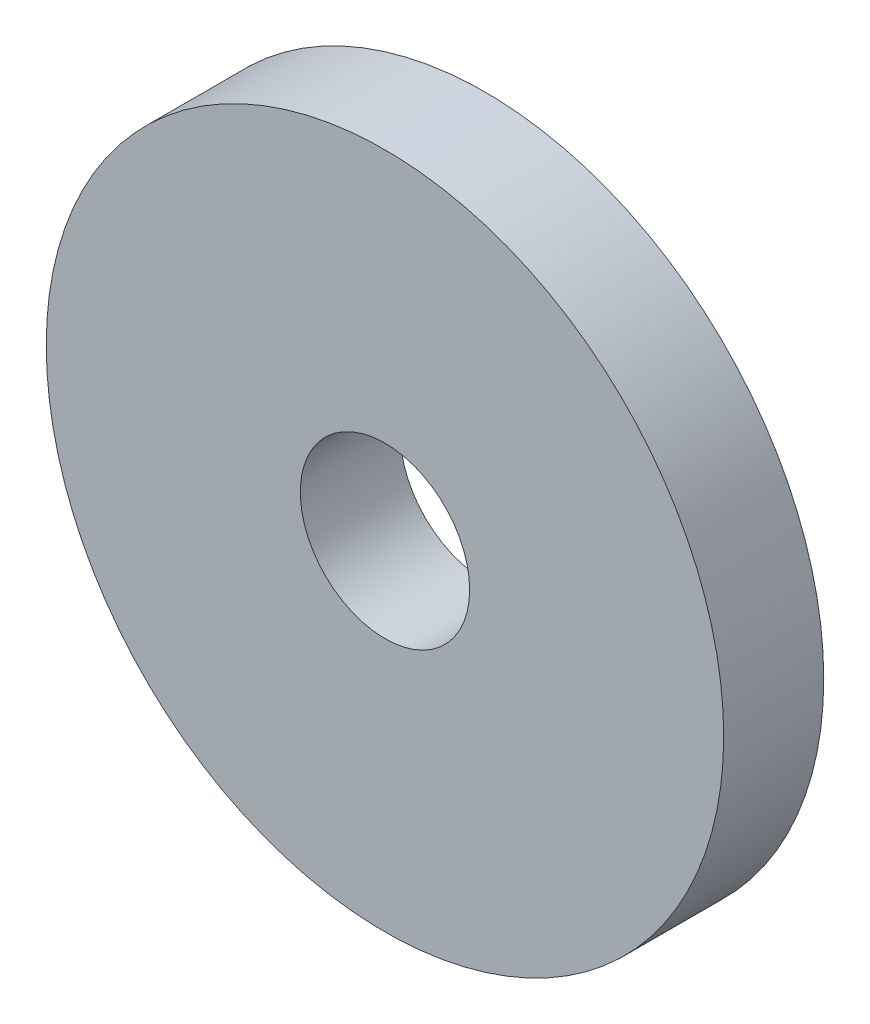
ISO-10303-21;
HEADER;
FILE_DESCRIPTION(('STEP AP214'),'2;1');
FILE_NAME('part.step','',(''),(''),'','','');
FILE_SCHEMA(('AUTOMOTIVE_DESIGN { 1 0 10303 214 1 1 1 1 }'));
ENDSEC;
DATA;
#1=APPLICATION_CONTEXT('core data for automotive mechanical design processes');
#2=APPLICATION_PROTOCOL_DEFINITION('international standard','automotive_design',2000,#1);
#3=PRODUCT_CONTEXT('',#1,'mechanical');
#4=PRODUCT('Part','Part','',(#3));
#5=PRODUCT_RELATED_PRODUCT_CATEGORY('part','',(#4));
#6=PRODUCT_DEFINITION_FORMATION('','',#4);
#7=PRODUCT_DEFINITION_CONTEXT('part definition',#1,'design');
#8=PRODUCT_DEFINITION('design','',#6,#7);
#9=PRODUCT_DEFINITION_SHAPE('','',#8);
#10=(LENGTH_UNIT() NAMED_UNIT(*) SI_UNIT(.MILLI.,.METRE.));
#11=(NAMED_UNIT(*) PLANE_ANGLE_UNIT() SI_UNIT($,.RADIAN.));
#12=(NAMED_UNIT(*) SI_UNIT($,.STERADIAN.) SOLID_ANGLE_UNIT());
#13=UNCERTAINTY_MEASURE_WITH_UNIT(LENGTH_MEASURE(1.E-05),#10,'distance_accuracy_value','');
#14=(GEOMETRIC_REPRESENTATION_CONTEXT(3) GLOBAL_UNCERTAINTY_ASSIGNED_CONTEXT((#13)) GLOBAL_UNIT_ASSIGNED_CONTEXT((#10,
#11,#12)) REPRESENTATION_CONTEXT('',''));
#15=CARTESIAN_POINT('',(0.,0.,0.));
#16=DIRECTION('',(0.,0.,1.));
#17=DIRECTION('',(1.,0.,0.));
#18=AXIS2_PLACEMENT_3D('',#15,#16,#17);
#19=CARTESIAN_POINT('',(0.,0.,29.5359367443001));
#20=DIRECTION('',(0.,0.,1.));
#21=DIRECTION('',(1.,0.,0.));
#22=AXIS2_PLACEMENT_3D('',#19,#20,#21);
#23=PLANE('',#22);
#24=CARTESIAN_POINT('',(0.,0.,29.5359367443001));
#25=DIRECTION('',(0.,0.,1.));
#26=DIRECTION('',(1.,0.,0.));
#27=AXIS2_PLACEMENT_3D('',#24,#25,#26);
#28=CIRCLE('',#27,25.);
#29=CARTESIAN_POINT('',(25.,0.,29.5359367443001));
#30=VERTEX_POINT('',#29);
#31=EDGE_CURVE('E35',#30,#30,#28,.T.);
#32=ORIENTED_EDGE('',*,*,#31,.F.);
#33=EDGE_LOOP('',(#32));
#34=FACE_BOUND('',#33,.T.);
#35=CARTESIAN_POINT('',(0.,0.,29.5359367443001));
#36=DIRECTION('',(0.,0.,1.));
#37=DIRECTION('',(1.,0.,0.));
#38=AXIS2_PLACEMENT_3D('',#35,#36,#37);
#39=CIRCLE('',#38,100.);
#40=CARTESIAN_POINT('',(100.,0.,29.5359367443001));
#41=VERTEX_POINT('',#40);
#42=EDGE_CURVE('E44',#41,#41,#39,.T.);
#43=ORIENTED_EDGE('',*,*,#42,.T.);
#44=EDGE_LOOP('',(#43));
#45=FACE_BOUND('',#44,.T.);
#46=ADVANCED_FACE('F31',(#34,#45),#23,.T.);
#47=CARTESIAN_POINT('',(0.,0.,0.));
#48=DIRECTION('',(0.,0.,1.));
#49=DIRECTION('',(1.,0.,0.));
#50=AXIS2_PLACEMENT_3D('',#47,#48,#49);
#51=PLANE('',#50);
#52=CARTESIAN_POINT('',(0.,0.,0.));
#53=DIRECTION('',(0.,0.,1.));
#54=DIRECTION('',(1.,0.,0.));
#55=AXIS2_PLACEMENT_3D('',#52,#53,#54);
#56=CIRCLE('',#55,25.);
#57=CARTESIAN_POINT('',(25.,0.,0.));
#58=VERTEX_POINT('',#57);
#59=EDGE_CURVE('E10',#58,#58,#56,.T.);
#60=ORIENTED_EDGE('',*,*,#59,.T.);
#61=EDGE_LOOP('',(#60));
#62=FACE_BOUND('',#61,.T.);
#63=CARTESIAN_POINT('',(0.,0.,0.));
#64=DIRECTION('',(0.,0.,1.));
#65=DIRECTION('',(1.,0.,0.));
#66=AXIS2_PLACEMENT_3D('',#63,#64,#65);
#67=CIRCLE('',#66,100.);
#68=CARTESIAN_POINT('',(100.,0.,0.));
#69=VERTEX_POINT('',#68);
#70=EDGE_CURVE('E42',#69,#69,#67,.T.);
#71=ORIENTED_EDGE('',*,*,#70,.F.);
#72=EDGE_LOOP('',(#71));
#73=FACE_BOUND('',#72,.T.);
#74=ADVANCED_FACE('F33',(#62,#73),#51,.F.);
#75=CARTESIAN_POINT('',(0.,0.,0.));
#76=DIRECTION('',(0.,0.,1.));
#77=DIRECTION('',(1.,0.,0.));
#78=AXIS2_PLACEMENT_3D('',#75,#76,#77);
#79=CYLINDRICAL_SURFACE('',#78,25.);
#80=ORIENTED_EDGE('',*,*,#59,.F.);
#81=EDGE_LOOP('',(#80));
#82=FACE_BOUND('',#81,.T.);
#83=ORIENTED_EDGE('',*,*,#31,.T.);
#84=EDGE_LOOP('',(#83));
#85=FACE_BOUND('',#84,.T.);
#86=ADVANCED_FACE('F54',(#82,#85),#79,.F.);
#87=CARTESIAN_POINT('',(0.,0.,0.));
#88=DIRECTION('',(0.,0.,1.));
#89=DIRECTION('',(1.,0.,0.));
#90=AXIS2_PLACEMENT_3D('',#87,#88,#89);
#91=CYLINDRICAL_SURFACE('',#90,100.);
#92=ORIENTED_EDGE('',*,*,#70,.T.);
#93=EDGE_LOOP('',(#92));
#94=FACE_BOUND('',#93,.T.);
#95=ORIENTED_EDGE('',*,*,#42,.F.);
#96=EDGE_LOOP('',(#95));
#97=FACE_BOUND('',#96,.T.);
#98=ADVANCED_FACE('F50',(#94,#97),#91,.T.);
#99=CLOSED_SHELL('',(#46,#74,#86,#98));
#100=MANIFOLD_SOLID_BREP('B2',#99);
#101=ADVANCED_BREP_SHAPE_REPRESENTATION('',(#18,#100),#14);
#102=SHAPE_DEFINITION_REPRESENTATION(#9,#101);
ENDSEC;
END-ISO-10303-21;
